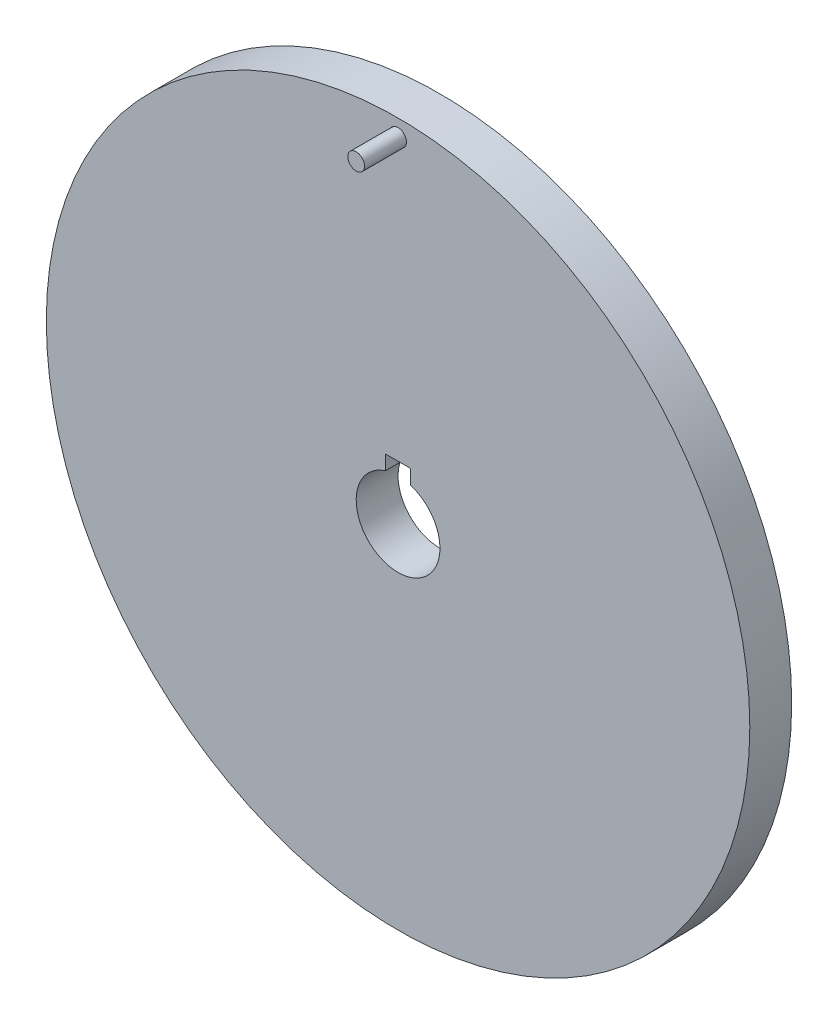
ISO-10303-21;
HEADER;
FILE_DESCRIPTION(('STEP AP214'),'2;1');
FILE_NAME('part.step','',(''),(''),'','','');
FILE_SCHEMA(('AUTOMOTIVE_DESIGN { 1 0 10303 214 1 1 1 1 }'));
ENDSEC;
DATA;
#1=APPLICATION_CONTEXT('core data for automotive mechanical design processes');
#2=APPLICATION_PROTOCOL_DEFINITION('international standard','automotive_design',2000,#1);
#3=PRODUCT_CONTEXT('',#1,'mechanical');
#4=PRODUCT('Part','Part','',(#3));
#5=PRODUCT_RELATED_PRODUCT_CATEGORY('part','',(#4));
#6=PRODUCT_DEFINITION_FORMATION('','',#4);
#7=PRODUCT_DEFINITION_CONTEXT('part definition',#1,'design');
#8=PRODUCT_DEFINITION('design','',#6,#7);
#9=PRODUCT_DEFINITION_SHAPE('','',#8);
#10=(LENGTH_UNIT() NAMED_UNIT(*) SI_UNIT(.MILLI.,.METRE.));
#11=(NAMED_UNIT(*) PLANE_ANGLE_UNIT() SI_UNIT($,.RADIAN.));
#12=(NAMED_UNIT(*) SI_UNIT($,.STERADIAN.) SOLID_ANGLE_UNIT());
#13=UNCERTAINTY_MEASURE_WITH_UNIT(LENGTH_MEASURE(1.E-05),#10,'distance_accuracy_value','');
#14=(GEOMETRIC_REPRESENTATION_CONTEXT(3) GLOBAL_UNCERTAINTY_ASSIGNED_CONTEXT((#13)) GLOBAL_UNIT_ASSIGNED_CONTEXT((#10,
#11,#12)) REPRESENTATION_CONTEXT('',''));
#15=CARTESIAN_POINT('',(0.,0.,0.));
#16=DIRECTION('',(0.,0.,1.));
#17=DIRECTION('',(1.,0.,0.));
#18=AXIS2_PLACEMENT_3D('',#15,#16,#17);
#19=CARTESIAN_POINT('',(0.,0.,5.));
#20=DIRECTION('',(0.,0.,-1.));
#21=DIRECTION('',(-1.,0.,0.));
#22=AXIS2_PLACEMENT_3D('',#19,#20,#21);
#23=CYLINDRICAL_SURFACE('',#22,42.);
#24=CARTESIAN_POINT('',(0.,0.,5.));
#25=DIRECTION('',(0.,0.,1.));
#26=DIRECTION('',(1.,0.,0.));
#27=AXIS2_PLACEMENT_3D('',#24,#25,#26);
#28=CIRCLE('',#27,42.);
#29=CARTESIAN_POINT('',(42.,0.,5.));
#30=VERTEX_POINT('',#29);
#31=EDGE_CURVE('E121',#30,#30,#28,.T.);
#32=ORIENTED_EDGE('',*,*,#31,.F.);
#33=EDGE_LOOP('',(#32));
#34=FACE_BOUND('',#33,.T.);
#35=CARTESIAN_POINT('',(0.,0.,0.));
#36=DIRECTION('',(0.,0.,1.));
#37=DIRECTION('',(1.,0.,0.));
#38=AXIS2_PLACEMENT_3D('',#35,#36,#37);
#39=CIRCLE('',#38,42.);
#40=CARTESIAN_POINT('',(42.,0.,0.));
#41=VERTEX_POINT('',#40);
#42=EDGE_CURVE('E118',#41,#41,#39,.T.);
#43=ORIENTED_EDGE('',*,*,#42,.T.);
#44=EDGE_LOOP('',(#43));
#45=FACE_BOUND('',#44,.T.);
#46=ADVANCED_FACE('F43',(#34,#45),#23,.T.);
#47=CARTESIAN_POINT('',(0.,0.,5.));
#48=DIRECTION('',(0.,0.,1.));
#49=DIRECTION('',(1.,0.,0.));
#50=AXIS2_PLACEMENT_3D('',#47,#48,#49);
#51=PLANE('',#50);
#52=DIRECTION('',(0.,-1.,0.));
#53=VECTOR('',#52,1.);
#54=CARTESIAN_POINT('',(-1.5,0.,5.));
#55=LINE('',#54,#53);
#56=CARTESIAN_POINT('',(-1.5,6.5,5.));
#57=VERTEX_POINT('',#56);
#58=CARTESIAN_POINT('',(-1.5,4.76969600708473,5.));
#59=VERTEX_POINT('',#58);
#60=EDGE_CURVE('E105',#57,#59,#55,.T.);
#61=ORIENTED_EDGE('',*,*,#60,.F.);
#62=DIRECTION('',(-1.,0.,0.));
#63=VECTOR('',#62,1.);
#64=CARTESIAN_POINT('',(-1.5,6.5,5.));
#65=LINE('',#64,#63);
#66=CARTESIAN_POINT('',(1.5,6.5,5.));
#67=VERTEX_POINT('',#66);
#68=EDGE_CURVE('E102',#67,#57,#65,.T.);
#69=ORIENTED_EDGE('',*,*,#68,.F.);
#70=DIRECTION('',(0.,1.,0.));
#71=VECTOR('',#70,1.);
#72=CARTESIAN_POINT('',(1.5,0.,5.));
#73=LINE('',#72,#71);
#74=CARTESIAN_POINT('',(1.5,4.76969600708473,5.));
#75=VERTEX_POINT('',#74);
#76=EDGE_CURVE('E84',#75,#67,#73,.T.);
#77=ORIENTED_EDGE('',*,*,#76,.F.);
#78=CARTESIAN_POINT('',(0.,0.,5.));
#79=DIRECTION('',(0.,0.,1.));
#80=DIRECTION('',(1.,0.,0.));
#81=AXIS2_PLACEMENT_3D('',#78,#79,#80);
#82=CIRCLE('',#81,5.);
#83=EDGE_CURVE('E109',#59,#75,#82,.T.);
#84=ORIENTED_EDGE('',*,*,#83,.F.);
#85=EDGE_LOOP('',(#61,#69,#77,#84));
#86=FACE_BOUND('',#85,.T.);
#87=CARTESIAN_POINT('',(0.,40.,5.));
#88=DIRECTION('',(0.,0.,1.));
#89=DIRECTION('',(1.,0.,0.));
#90=AXIS2_PLACEMENT_3D('',#87,#88,#89);
#91=CIRCLE('',#90,1.);
#92=CARTESIAN_POINT('',(1.,40.,5.));
#93=VERTEX_POINT('',#92);
#94=EDGE_CURVE('E112',#93,#93,#91,.T.);
#95=ORIENTED_EDGE('',*,*,#94,.F.);
#96=EDGE_LOOP('',(#95));
#97=FACE_BOUND('',#96,.T.);
#98=ORIENTED_EDGE('',*,*,#31,.T.);
#99=EDGE_LOOP('',(#98));
#100=FACE_BOUND('',#99,.T.);
#101=ADVANCED_FACE('F130',(#86,#97,#100),#51,.T.);
#102=CARTESIAN_POINT('',(0.,0.,0.));
#103=DIRECTION('',(0.,0.,1.));
#104=DIRECTION('',(1.,0.,0.));
#105=AXIS2_PLACEMENT_3D('',#102,#103,#104);
#106=PLANE('',#105);
#107=DIRECTION('',(-1.,0.,0.));
#108=VECTOR('',#107,1.);
#109=CARTESIAN_POINT('',(-1.5,6.5,0.));
#110=LINE('',#109,#108);
#111=CARTESIAN_POINT('',(1.5,6.5,0.));
#112=VERTEX_POINT('',#111);
#113=CARTESIAN_POINT('',(-1.5,6.5,0.));
#114=VERTEX_POINT('',#113);
#115=EDGE_CURVE('E89',#112,#114,#110,.T.);
#116=ORIENTED_EDGE('',*,*,#115,.T.);
#117=DIRECTION('',(0.,-1.,0.));
#118=VECTOR('',#117,1.);
#119=CARTESIAN_POINT('',(-1.5,0.,0.));
#120=LINE('',#119,#118);
#121=CARTESIAN_POINT('',(-1.5,4.76969600708473,0.));
#122=VERTEX_POINT('',#121);
#123=EDGE_CURVE('E100',#114,#122,#120,.T.);
#124=ORIENTED_EDGE('',*,*,#123,.T.);
#125=CARTESIAN_POINT('',(0.,0.,0.));
#126=DIRECTION('',(0.,0.,1.));
#127=DIRECTION('',(1.,0.,0.));
#128=AXIS2_PLACEMENT_3D('',#125,#126,#127);
#129=CIRCLE('',#128,5.);
#130=CARTESIAN_POINT('',(1.5,4.76969600708473,0.));
#131=VERTEX_POINT('',#130);
#132=EDGE_CURVE('E99',#122,#131,#129,.T.);
#133=ORIENTED_EDGE('',*,*,#132,.T.);
#134=DIRECTION('',(0.,1.,0.));
#135=VECTOR('',#134,1.);
#136=CARTESIAN_POINT('',(1.5,0.,0.));
#137=LINE('',#136,#135);
#138=EDGE_CURVE('E57',#131,#112,#137,.T.);
#139=ORIENTED_EDGE('',*,*,#138,.T.);
#140=EDGE_LOOP('',(#116,#124,#133,#139));
#141=FACE_BOUND('',#140,.T.);
#142=ORIENTED_EDGE('',*,*,#42,.F.);
#143=EDGE_LOOP('',(#142));
#144=FACE_BOUND('',#143,.T.);
#145=ADVANCED_FACE('F96',(#141,#144),#106,.F.);
#146=CARTESIAN_POINT('',(0.,40.,10.));
#147=DIRECTION('',(0.,0.,-1.));
#148=DIRECTION('',(-1.,0.,0.));
#149=AXIS2_PLACEMENT_3D('',#146,#147,#148);
#150=CYLINDRICAL_SURFACE('',#149,1.);
#151=CARTESIAN_POINT('',(0.,40.,10.));
#152=DIRECTION('',(0.,0.,1.));
#153=DIRECTION('',(1.,0.,0.));
#154=AXIS2_PLACEMENT_3D('',#151,#152,#153);
#155=CIRCLE('',#154,1.);
#156=CARTESIAN_POINT('',(1.,40.,10.));
#157=VERTEX_POINT('',#156);
#158=EDGE_CURVE('E115',#157,#157,#155,.T.);
#159=ORIENTED_EDGE('',*,*,#158,.F.);
#160=EDGE_LOOP('',(#159));
#161=FACE_BOUND('',#160,.T.);
#162=ORIENTED_EDGE('',*,*,#94,.T.);
#163=EDGE_LOOP('',(#162));
#164=FACE_BOUND('',#163,.T.);
#165=ADVANCED_FACE('F152',(#161,#164),#150,.T.);
#166=CARTESIAN_POINT('',(0.,40.,10.));
#167=DIRECTION('',(0.,0.,1.));
#168=DIRECTION('',(1.,0.,0.));
#169=AXIS2_PLACEMENT_3D('',#166,#167,#168);
#170=PLANE('',#169);
#171=ORIENTED_EDGE('',*,*,#158,.T.);
#172=EDGE_LOOP('',(#171));
#173=FACE_BOUND('',#172,.T.);
#174=ADVANCED_FACE('F140',(#173),#170,.T.);
#175=CARTESIAN_POINT('',(0.,0.,0.));
#176=DIRECTION('',(0.,0.,1.));
#177=DIRECTION('',(1.,0.,0.));
#178=AXIS2_PLACEMENT_3D('',#175,#176,#177);
#179=CYLINDRICAL_SURFACE('',#178,5.);
#180=ORIENTED_EDGE('',*,*,#132,.F.);
#181=DIRECTION('',(0.,0.,1.));
#182=VECTOR('',#181,1.);
#183=CARTESIAN_POINT('',(-1.5,4.76969600708473,0.));
#184=LINE('',#183,#182);
#185=EDGE_CURVE('E11',#122,#59,#184,.T.);
#186=ORIENTED_EDGE('',*,*,#185,.T.);
#187=ORIENTED_EDGE('',*,*,#83,.T.);
#188=DIRECTION('',(0.,0.,1.));
#189=VECTOR('',#188,1.);
#190=CARTESIAN_POINT('',(1.5,4.76969600708473,0.));
#191=LINE('',#190,#189);
#192=EDGE_CURVE('E50',#75,#131,#191,.F.);
#193=ORIENTED_EDGE('',*,*,#192,.T.);
#194=EDGE_LOOP('',(#180,#186,#187,#193));
#195=FACE_BOUND('',#194,.T.);
#196=ADVANCED_FACE('F126',(#195),#179,.F.);
#197=CARTESIAN_POINT('',(-1.5,0.,0.));
#198=DIRECTION('',(-1.,0.,0.));
#199=DIRECTION('',(0.,0.,1.));
#200=AXIS2_PLACEMENT_3D('',#197,#198,#199);
#201=PLANE('',#200);
#202=ORIENTED_EDGE('',*,*,#123,.F.);
#203=DIRECTION('',(0.,0.,1.));
#204=VECTOR('',#203,1.);
#205=CARTESIAN_POINT('',(-1.5,6.5,0.));
#206=LINE('',#205,#204);
#207=EDGE_CURVE('E88',#114,#57,#206,.T.);
#208=ORIENTED_EDGE('',*,*,#207,.T.);
#209=ORIENTED_EDGE('',*,*,#60,.T.);
#210=ORIENTED_EDGE('',*,*,#185,.F.);
#211=EDGE_LOOP('',(#202,#208,#209,#210));
#212=FACE_BOUND('',#211,.T.);
#213=ADVANCED_FACE('F132',(#212),#201,.F.);
#214=CARTESIAN_POINT('',(1.5,0.,0.));
#215=DIRECTION('',(1.,0.,0.));
#216=DIRECTION('',(0.,0.,-1.));
#217=AXIS2_PLACEMENT_3D('',#214,#215,#216);
#218=PLANE('',#217);
#219=ORIENTED_EDGE('',*,*,#76,.T.);
#220=DIRECTION('',(0.,0.,1.));
#221=VECTOR('',#220,1.);
#222=CARTESIAN_POINT('',(1.5,6.5,0.));
#223=LINE('',#222,#221);
#224=EDGE_CURVE('E80',#112,#67,#223,.T.);
#225=ORIENTED_EDGE('',*,*,#224,.F.);
#226=ORIENTED_EDGE('',*,*,#138,.F.);
#227=ORIENTED_EDGE('',*,*,#192,.F.);
#228=EDGE_LOOP('',(#219,#225,#226,#227));
#229=FACE_BOUND('',#228,.T.);
#230=ADVANCED_FACE('F82',(#229),#218,.F.);
#231=CARTESIAN_POINT('',(-1.5,6.5,0.));
#232=DIRECTION('',(0.,1.,0.));
#233=DIRECTION('',(0.,0.,1.));
#234=AXIS2_PLACEMENT_3D('',#231,#232,#233);
#235=PLANE('',#234);
#236=ORIENTED_EDGE('',*,*,#68,.T.);
#237=ORIENTED_EDGE('',*,*,#207,.F.);
#238=ORIENTED_EDGE('',*,*,#115,.F.);
#239=ORIENTED_EDGE('',*,*,#224,.T.);
#240=EDGE_LOOP('',(#236,#237,#238,#239));
#241=FACE_BOUND('',#240,.T.);
#242=ADVANCED_FACE('F92',(#241),#235,.F.);
#243=CLOSED_SHELL('',(#46,#101,#145,#165,#174,#196,#213,#230,#242));
#244=MANIFOLD_SOLID_BREP('B2',#243);
#245=ADVANCED_BREP_SHAPE_REPRESENTATION('',(#18,#244),#14);
#246=SHAPE_DEFINITION_REPRESENTATION(#9,#245);
ENDSEC;
END-ISO-10303-21;
